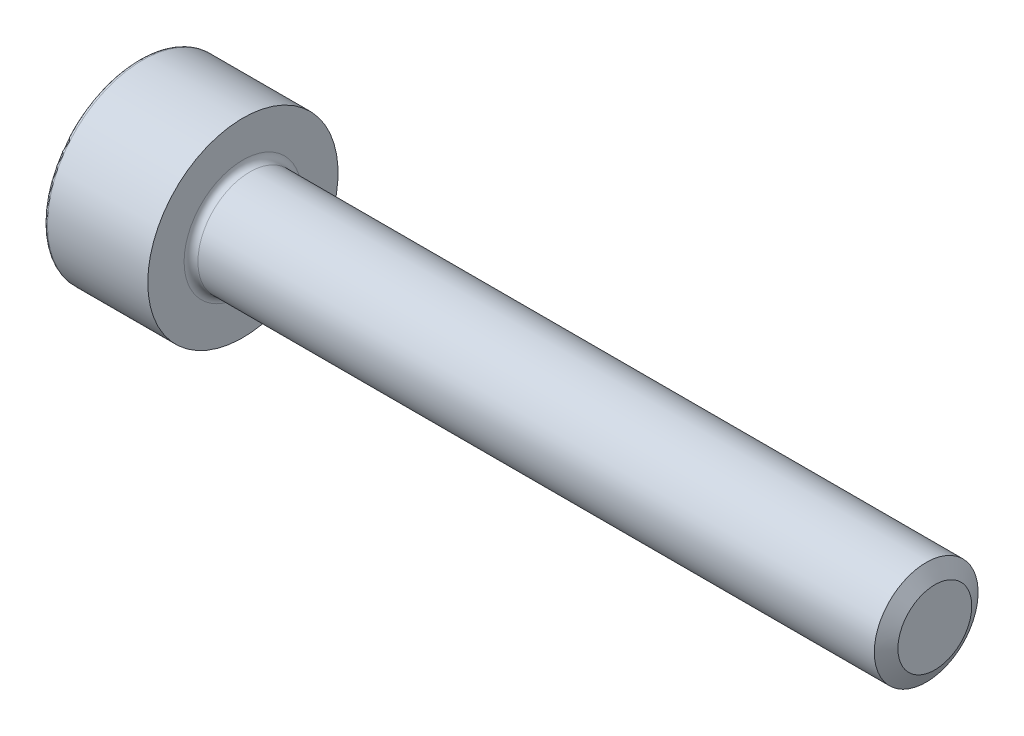
ISO-10303-21;
HEADER;
FILE_DESCRIPTION(('STEP AP214'),'2;1');
FILE_NAME('part.step','',(''),(''),'','','');
FILE_SCHEMA(('AUTOMOTIVE_DESIGN { 1 0 10303 214 1 1 1 1 }'));
ENDSEC;
DATA;
#1=APPLICATION_CONTEXT('core data for automotive mechanical design processes');
#2=APPLICATION_PROTOCOL_DEFINITION('international standard','automotive_design',2000,#1);
#3=PRODUCT_CONTEXT('',#1,'mechanical');
#4=PRODUCT('Part','Part','',(#3));
#5=PRODUCT_RELATED_PRODUCT_CATEGORY('part','',(#4));
#6=PRODUCT_DEFINITION_FORMATION('','',#4);
#7=PRODUCT_DEFINITION_CONTEXT('part definition',#1,'design');
#8=PRODUCT_DEFINITION('design','',#6,#7);
#9=PRODUCT_DEFINITION_SHAPE('','',#8);
#10=(LENGTH_UNIT() NAMED_UNIT(*) SI_UNIT(.MILLI.,.METRE.));
#11=(NAMED_UNIT(*) PLANE_ANGLE_UNIT() SI_UNIT($,.RADIAN.));
#12=(NAMED_UNIT(*) SI_UNIT($,.STERADIAN.) SOLID_ANGLE_UNIT());
#13=UNCERTAINTY_MEASURE_WITH_UNIT(LENGTH_MEASURE(1.E-05),#10,'distance_accuracy_value','');
#14=(GEOMETRIC_REPRESENTATION_CONTEXT(3) GLOBAL_UNCERTAINTY_ASSIGNED_CONTEXT((#13)) GLOBAL_UNIT_ASSIGNED_CONTEXT((#10,
#11,#12)) REPRESENTATION_CONTEXT('',''));
#15=CARTESIAN_POINT('',(0.,0.,0.));
#16=DIRECTION('',(0.,0.,1.));
#17=DIRECTION('',(1.,0.,0.));
#18=AXIS2_PLACEMENT_3D('',#15,#16,#17);
#19=CARTESIAN_POINT('',(0.,0.,0.));
#20=DIRECTION('',(-1.,0.,0.));
#21=DIRECTION('',(0.,0.,1.));
#22=AXIS2_PLACEMENT_3D('',#19,#20,#21);
#23=CYLINDRICAL_SURFACE('',#22,1.5);
#24=CARTESIAN_POINT('',(3.2,0.,0.));
#25=DIRECTION('',(-1.,0.,0.));
#26=DIRECTION('',(0.,0.,1.));
#27=AXIS2_PLACEMENT_3D('',#24,#25,#26);
#28=CIRCLE('',#27,1.5);
#29=CARTESIAN_POINT('',(3.2,0.,1.5));
#30=VERTEX_POINT('',#29);
#31=EDGE_CURVE('E142',#30,#30,#28,.T.);
#32=ORIENTED_EDGE('',*,*,#31,.F.);
#33=EDGE_LOOP('',(#32));
#34=FACE_BOUND('',#33,.T.);
#35=CARTESIAN_POINT('',(22.7500073334409,0.,0.));
#36=DIRECTION('',(-1.,0.,0.));
#37=DIRECTION('',(0.,0.,1.));
#38=AXIS2_PLACEMENT_3D('',#35,#36,#37);
#39=CIRCLE('',#38,1.5);
#40=CARTESIAN_POINT('',(22.7500073334409,0.,1.5));
#41=VERTEX_POINT('',#40);
#42=EDGE_CURVE('E279',#41,#41,#39,.T.);
#43=ORIENTED_EDGE('',*,*,#42,.T.);
#44=EDGE_LOOP('',(#43));
#45=FACE_BOUND('',#44,.T.);
#46=ADVANCED_FACE('F39',(#34,#45),#23,.T.);
#47=CARTESIAN_POINT('',(0.,0.,0.));
#48=DIRECTION('',(1.,0.,0.));
#49=DIRECTION('',(0.,0.,-1.));
#50=AXIS2_PLACEMENT_3D('',#47,#48,#49);
#51=PLANE('',#50);
#52=CARTESIAN_POINT('',(0.,0.,0.));
#53=DIRECTION('',(1.,0.,0.));
#54=DIRECTION('',(0.,0.,-1.));
#55=AXIS2_PLACEMENT_3D('',#52,#53,#54);
#56=CIRCLE('',#55,2.65);
#57=CARTESIAN_POINT('',(0.,0.,-2.65));
#58=VERTEX_POINT('',#57);
#59=EDGE_CURVE('E47',#58,#58,#56,.F.);
#60=ORIENTED_EDGE('',*,*,#59,.T.);
#61=EDGE_LOOP('',(#60));
#62=FACE_BOUND('',#61,.T.);
#63=DIRECTION('',(0.,0.866025403784439,-0.5));
#64=VECTOR('',#63,1.);
#65=CARTESIAN_POINT('',(0.,0.,1.435));
#66=LINE('',#65,#64);
#67=CARTESIAN_POINT('',(0.,0.,1.435));
#68=VERTEX_POINT('',#67);
#69=CARTESIAN_POINT('',(0.,1.24274645443067,0.717499999999999));
#70=VERTEX_POINT('',#69);
#71=EDGE_CURVE('E128',#68,#70,#66,.T.);
#72=ORIENTED_EDGE('',*,*,#71,.F.);
#73=DIRECTION('',(0.,0.866025403784439,0.5));
#74=VECTOR('',#73,1.);
#75=CARTESIAN_POINT('',(0.,-1.24274645443067,0.7175));
#76=LINE('',#75,#74);
#77=CARTESIAN_POINT('',(0.,-1.24274645443067,0.7175));
#78=VERTEX_POINT('',#77);
#79=EDGE_CURVE('E54',#78,#68,#76,.T.);
#80=ORIENTED_EDGE('',*,*,#79,.F.);
#81=DIRECTION('',(0.,0.,1.));
#82=VECTOR('',#81,1.);
#83=CARTESIAN_POINT('',(0.,-1.24274645443067,-0.7175));
#84=LINE('',#83,#82);
#85=CARTESIAN_POINT('',(0.,-1.24274645443067,-0.7175));
#86=VERTEX_POINT('',#85);
#87=EDGE_CURVE('E138',#86,#78,#84,.T.);
#88=ORIENTED_EDGE('',*,*,#87,.F.);
#89=DIRECTION('',(0.,-0.866025403784439,0.5));
#90=VECTOR('',#89,1.);
#91=CARTESIAN_POINT('',(0.,0.,-1.435));
#92=LINE('',#91,#90);
#93=CARTESIAN_POINT('',(0.,0.,-1.435));
#94=VERTEX_POINT('',#93);
#95=EDGE_CURVE('E136',#94,#86,#92,.T.);
#96=ORIENTED_EDGE('',*,*,#95,.F.);
#97=DIRECTION('',(0.,-0.866025403784439,-0.5));
#98=VECTOR('',#97,1.);
#99=CARTESIAN_POINT('',(0.,1.24274645443067,-0.7175));
#100=LINE('',#99,#98);
#101=CARTESIAN_POINT('',(0.,1.24274645443067,-0.7175));
#102=VERTEX_POINT('',#101);
#103=EDGE_CURVE('E102',#102,#94,#100,.T.);
#104=ORIENTED_EDGE('',*,*,#103,.F.);
#105=DIRECTION('',(0.,0.,-1.));
#106=VECTOR('',#105,1.);
#107=CARTESIAN_POINT('',(0.,1.24274645443067,0.717499999999999));
#108=LINE('',#107,#106);
#109=EDGE_CURVE('E132',#70,#102,#108,.T.);
#110=ORIENTED_EDGE('',*,*,#109,.F.);
#111=EDGE_LOOP('',(#72,#80,#88,#96,#104,#110));
#112=FACE_BOUND('',#111,.T.);
#113=ADVANCED_FACE('F159',(#62,#112),#51,.F.);
#114=CARTESIAN_POINT('',(0.,0.,0.));
#115=DIRECTION('',(-1.,0.,0.));
#116=DIRECTION('',(0.,0.,1.));
#117=AXIS2_PLACEMENT_3D('',#114,#115,#116);
#118=CYLINDRICAL_SURFACE('',#117,2.75);
#119=CARTESIAN_POINT('',(0.1,0.,0.));
#120=DIRECTION('',(1.,0.,0.));
#121=DIRECTION('',(0.,0.,-1.));
#122=AXIS2_PLACEMENT_3D('',#119,#120,#121);
#123=CIRCLE('',#122,2.75);
#124=CARTESIAN_POINT('',(0.1,0.,-2.75));
#125=VERTEX_POINT('',#124);
#126=EDGE_CURVE('E11',#125,#125,#123,.T.);
#127=ORIENTED_EDGE('',*,*,#126,.T.);
#128=EDGE_LOOP('',(#127));
#129=FACE_BOUND('',#128,.T.);
#130=CARTESIAN_POINT('',(3.,0.,0.));
#131=DIRECTION('',(-1.,0.,0.));
#132=DIRECTION('',(0.,0.,1.));
#133=AXIS2_PLACEMENT_3D('',#130,#131,#132);
#134=CIRCLE('',#133,2.75);
#135=CARTESIAN_POINT('',(3.,0.,2.75));
#136=VERTEX_POINT('',#135);
#137=EDGE_CURVE('E153',#136,#136,#134,.T.);
#138=ORIENTED_EDGE('',*,*,#137,.T.);
#139=EDGE_LOOP('',(#138));
#140=FACE_BOUND('',#139,.T.);
#141=ADVANCED_FACE('F178',(#129,#140),#118,.T.);
#142=CARTESIAN_POINT('',(3.,2.75,0.));
#143=DIRECTION('',(-1.,0.,0.));
#144=DIRECTION('',(0.,0.,1.));
#145=AXIS2_PLACEMENT_3D('',#142,#143,#144);
#146=PLANE('',#145);
#147=ORIENTED_EDGE('',*,*,#137,.F.);
#148=EDGE_LOOP('',(#147));
#149=FACE_BOUND('',#148,.T.);
#150=CARTESIAN_POINT('',(3.,0.,0.));
#151=DIRECTION('',(-1.,0.,0.));
#152=DIRECTION('',(0.,0.,1.));
#153=AXIS2_PLACEMENT_3D('',#150,#151,#152);
#154=CIRCLE('',#153,1.7);
#155=CARTESIAN_POINT('',(3.,0.,1.7));
#156=VERTEX_POINT('',#155);
#157=EDGE_CURVE('E150',#156,#156,#154,.T.);
#158=ORIENTED_EDGE('',*,*,#157,.T.);
#159=EDGE_LOOP('',(#158));
#160=FACE_BOUND('',#159,.T.);
#161=ADVANCED_FACE('F187',(#149,#160),#146,.F.);
#162=CARTESIAN_POINT('',(3.2,0.,0.));
#163=DIRECTION('',(-1.,0.,0.));
#164=DIRECTION('',(0.,0.,1.));
#165=AXIS2_PLACEMENT_3D('',#162,#163,#164);
#166=TOROIDAL_SURFACE('',#165,1.7,0.2);
#167=ORIENTED_EDGE('',*,*,#157,.F.);
#168=EDGE_LOOP('',(#167));
#169=FACE_BOUND('',#168,.T.);
#170=ORIENTED_EDGE('',*,*,#31,.T.);
#171=EDGE_LOOP('',(#170));
#172=FACE_BOUND('',#171,.T.);
#173=ADVANCED_FACE('F183',(#169,#172),#166,.F.);
#174=CARTESIAN_POINT('',(1.3,-1.24274645443067,0.7175));
#175=DIRECTION('',(0.,-0.5,0.866025403784439));
#176=DIRECTION('',(0.,-0.866025403784439,-0.5));
#177=AXIS2_PLACEMENT_3D('',#174,#175,#176);
#178=PLANE('',#177);
#179=ORIENTED_EDGE('',*,*,#79,.T.);
#180=DIRECTION('',(-1.,0.,0.));
#181=VECTOR('',#180,1.);
#182=CARTESIAN_POINT('',(1.3,0.,1.435));
#183=LINE('',#182,#181);
#184=CARTESIAN_POINT('',(1.3,0.,1.435));
#185=VERTEX_POINT('',#184);
#186=EDGE_CURVE('E84',#185,#68,#183,.T.);
#187=ORIENTED_EDGE('',*,*,#186,.F.);
#188=DIRECTION('',(0.,0.866025403784439,0.5));
#189=VECTOR('',#188,1.);
#190=CARTESIAN_POINT('',(1.3,-1.24274645443067,0.7175));
#191=LINE('',#190,#189);
#192=CARTESIAN_POINT('',(1.3,-1.24274645443067,0.7175));
#193=VERTEX_POINT('',#192);
#194=EDGE_CURVE('E140',#193,#185,#191,.T.);
#195=ORIENTED_EDGE('',*,*,#194,.F.);
#196=DIRECTION('',(-1.,0.,0.));
#197=VECTOR('',#196,1.);
#198=CARTESIAN_POINT('',(1.3,-1.24274645443067,0.7175));
#199=LINE('',#198,#197);
#200=EDGE_CURVE('E62',#193,#78,#199,.T.);
#201=ORIENTED_EDGE('',*,*,#200,.T.);
#202=EDGE_LOOP('',(#179,#187,#195,#201));
#203=FACE_BOUND('',#202,.T.);
#204=ADVANCED_FACE('F186',(#203),#178,.F.);
#205=CARTESIAN_POINT('',(1.3,-1.24274645443067,-0.7175));
#206=DIRECTION('',(0.,-1.,0.));
#207=DIRECTION('',(0.,0.,-1.));
#208=AXIS2_PLACEMENT_3D('',#205,#206,#207);
#209=PLANE('',#208);
#210=ORIENTED_EDGE('',*,*,#87,.T.);
#211=ORIENTED_EDGE('',*,*,#200,.F.);
#212=DIRECTION('',(0.,0.,1.));
#213=VECTOR('',#212,1.);
#214=CARTESIAN_POINT('',(1.3,-1.24274645443067,-0.7175));
#215=LINE('',#214,#213);
#216=CARTESIAN_POINT('',(1.3,-1.24274645443067,-0.7175));
#217=VERTEX_POINT('',#216);
#218=EDGE_CURVE('E114',#217,#193,#215,.T.);
#219=ORIENTED_EDGE('',*,*,#218,.F.);
#220=DIRECTION('',(-1.,0.,0.));
#221=VECTOR('',#220,1.);
#222=CARTESIAN_POINT('',(1.3,-1.24274645443067,-0.7175));
#223=LINE('',#222,#221);
#224=EDGE_CURVE('E106',#217,#86,#223,.T.);
#225=ORIENTED_EDGE('',*,*,#224,.T.);
#226=EDGE_LOOP('',(#210,#211,#219,#225));
#227=FACE_BOUND('',#226,.T.);
#228=ADVANCED_FACE('F217',(#227),#209,.F.);
#229=CARTESIAN_POINT('',(1.3,0.,-1.435));
#230=DIRECTION('',(0.,-0.5,-0.866025403784439));
#231=DIRECTION('',(0.,0.866025403784439,-0.5));
#232=AXIS2_PLACEMENT_3D('',#229,#230,#231);
#233=PLANE('',#232);
#234=ORIENTED_EDGE('',*,*,#95,.T.);
#235=ORIENTED_EDGE('',*,*,#224,.F.);
#236=DIRECTION('',(0.,-0.866025403784439,0.5));
#237=VECTOR('',#236,1.);
#238=CARTESIAN_POINT('',(1.3,0.,-1.435));
#239=LINE('',#238,#237);
#240=CARTESIAN_POINT('',(1.3,0.,-1.435));
#241=VERTEX_POINT('',#240);
#242=EDGE_CURVE('E110',#241,#217,#239,.T.);
#243=ORIENTED_EDGE('',*,*,#242,.F.);
#244=DIRECTION('',(-1.,0.,0.));
#245=VECTOR('',#244,1.);
#246=CARTESIAN_POINT('',(1.3,0.,-1.435));
#247=LINE('',#246,#245);
#248=EDGE_CURVE('E95',#241,#94,#247,.T.);
#249=ORIENTED_EDGE('',*,*,#248,.T.);
#250=EDGE_LOOP('',(#234,#235,#243,#249));
#251=FACE_BOUND('',#250,.T.);
#252=ADVANCED_FACE('F111',(#251),#233,.F.);
#253=CARTESIAN_POINT('',(1.3,1.24274645443067,-0.7175));
#254=DIRECTION('',(0.,0.5,-0.866025403784439));
#255=DIRECTION('',(0.,0.866025403784439,0.5));
#256=AXIS2_PLACEMENT_3D('',#253,#254,#255);
#257=PLANE('',#256);
#258=ORIENTED_EDGE('',*,*,#103,.T.);
#259=ORIENTED_EDGE('',*,*,#248,.F.);
#260=DIRECTION('',(0.,-0.866025403784439,-0.5));
#261=VECTOR('',#260,1.);
#262=CARTESIAN_POINT('',(1.3,1.24274645443067,-0.7175));
#263=LINE('',#262,#261);
#264=CARTESIAN_POINT('',(1.3,1.24274645443067,-0.7175));
#265=VERTEX_POINT('',#264);
#266=EDGE_CURVE('E99',#265,#241,#263,.T.);
#267=ORIENTED_EDGE('',*,*,#266,.F.);
#268=DIRECTION('',(-1.,0.,0.));
#269=VECTOR('',#268,1.);
#270=CARTESIAN_POINT('',(1.3,1.24274645443067,-0.7175));
#271=LINE('',#270,#269);
#272=EDGE_CURVE('E107',#265,#102,#271,.T.);
#273=ORIENTED_EDGE('',*,*,#272,.T.);
#274=EDGE_LOOP('',(#258,#259,#267,#273));
#275=FACE_BOUND('',#274,.T.);
#276=ADVANCED_FACE('F97',(#275),#257,.F.);
#277=CARTESIAN_POINT('',(1.3,1.24274645443067,0.717499999999999));
#278=DIRECTION('',(0.,1.,0.));
#279=DIRECTION('',(0.,0.,1.));
#280=AXIS2_PLACEMENT_3D('',#277,#278,#279);
#281=PLANE('',#280);
#282=ORIENTED_EDGE('',*,*,#109,.T.);
#283=ORIENTED_EDGE('',*,*,#272,.F.);
#284=DIRECTION('',(0.,0.,-1.));
#285=VECTOR('',#284,1.);
#286=CARTESIAN_POINT('',(1.3,1.24274645443067,0.717499999999999));
#287=LINE('',#286,#285);
#288=CARTESIAN_POINT('',(1.3,1.24274645443067,0.717499999999999));
#289=VERTEX_POINT('',#288);
#290=EDGE_CURVE('E120',#289,#265,#287,.T.);
#291=ORIENTED_EDGE('',*,*,#290,.F.);
#292=DIRECTION('',(-1.,0.,0.));
#293=VECTOR('',#292,1.);
#294=CARTESIAN_POINT('',(1.3,1.24274645443067,0.717499999999999));
#295=LINE('',#294,#293);
#296=EDGE_CURVE('E145',#289,#70,#295,.T.);
#297=ORIENTED_EDGE('',*,*,#296,.T.);
#298=EDGE_LOOP('',(#282,#283,#291,#297));
#299=FACE_BOUND('',#298,.T.);
#300=ADVANCED_FACE('F235',(#299),#281,.F.);
#301=CARTESIAN_POINT('',(1.3,0.,1.435));
#302=DIRECTION('',(0.,0.5,0.866025403784439));
#303=DIRECTION('',(0.,-0.866025403784439,0.5));
#304=AXIS2_PLACEMENT_3D('',#301,#302,#303);
#305=PLANE('',#304);
#306=ORIENTED_EDGE('',*,*,#71,.T.);
#307=ORIENTED_EDGE('',*,*,#296,.F.);
#308=DIRECTION('',(0.,0.866025403784439,-0.5));
#309=VECTOR('',#308,1.);
#310=CARTESIAN_POINT('',(1.3,0.,1.435));
#311=LINE('',#310,#309);
#312=EDGE_CURVE('E122',#185,#289,#311,.T.);
#313=ORIENTED_EDGE('',*,*,#312,.F.);
#314=ORIENTED_EDGE('',*,*,#186,.T.);
#315=EDGE_LOOP('',(#306,#307,#313,#314));
#316=FACE_BOUND('',#315,.T.);
#317=ADVANCED_FACE('F242',(#316),#305,.F.);
#318=CARTESIAN_POINT('',(1.3,-1.24274645443067,0.7175));
#319=DIRECTION('',(1.,0.,0.));
#320=DIRECTION('',(0.,0.,-1.));
#321=AXIS2_PLACEMENT_3D('',#318,#319,#320);
#322=PLANE('',#321);
#323=ORIENTED_EDGE('',*,*,#194,.T.);
#324=ORIENTED_EDGE('',*,*,#312,.T.);
#325=ORIENTED_EDGE('',*,*,#290,.T.);
#326=ORIENTED_EDGE('',*,*,#266,.T.);
#327=ORIENTED_EDGE('',*,*,#242,.T.);
#328=ORIENTED_EDGE('',*,*,#218,.T.);
#329=EDGE_LOOP('',(#323,#324,#325,#326,#327,#328));
#330=FACE_BOUND('',#329,.T.);
#331=ADVANCED_FACE('F117',(#330),#322,.F.);
#332=CARTESIAN_POINT('',(22.7500073334409,0.,0.));
#333=DIRECTION('',(-1.,0.,0.));
#334=DIRECTION('',(0.,0.,1.));
#335=AXIS2_PLACEMENT_3D('',#332,#333,#334);
#336=CONICAL_SURFACE('',#335,1.5,1.04719755119659);
#337=CARTESIAN_POINT('',(23.,0.,0.));
#338=DIRECTION('',(-1.,0.,0.));
#339=DIRECTION('',(0.,0.,1.));
#340=AXIS2_PLACEMENT_3D('',#337,#338,#339);
#341=CIRCLE('',#340,1.067);
#342=CARTESIAN_POINT('',(23.,0.,1.067));
#343=VERTEX_POINT('',#342);
#344=EDGE_CURVE('E129',#343,#343,#341,.T.);
#345=ORIENTED_EDGE('',*,*,#344,.T.);
#346=EDGE_LOOP('',(#345));
#347=FACE_BOUND('',#346,.T.);
#348=ORIENTED_EDGE('',*,*,#42,.F.);
#349=EDGE_LOOP('',(#348));
#350=FACE_BOUND('',#349,.T.);
#351=ADVANCED_FACE('F168',(#347,#350),#336,.T.);
#352=CARTESIAN_POINT('',(23.,1.5,0.));
#353=DIRECTION('',(-1.,0.,0.));
#354=DIRECTION('',(0.,0.,1.));
#355=AXIS2_PLACEMENT_3D('',#352,#353,#354);
#356=PLANE('',#355);
#357=ORIENTED_EDGE('',*,*,#344,.F.);
#358=EDGE_LOOP('',(#357));
#359=FACE_BOUND('',#358,.T.);
#360=ADVANCED_FACE('F163',(#359),#356,.F.);
#361=CARTESIAN_POINT('',(0.1,0.,0.));
#362=DIRECTION('',(1.,0.,0.));
#363=DIRECTION('',(0.,0.,-1.));
#364=AXIS2_PLACEMENT_3D('',#361,#362,#363);
#365=TOROIDAL_SURFACE('',#364,2.65,0.1);
#366=ORIENTED_EDGE('',*,*,#126,.F.);
#367=EDGE_LOOP('',(#366));
#368=FACE_BOUND('',#367,.T.);
#369=ORIENTED_EDGE('',*,*,#59,.F.);
#370=EDGE_LOOP('',(#369));
#371=FACE_BOUND('',#370,.T.);
#372=ADVANCED_FACE('F41',(#368,#371),#365,.T.);
#373=CLOSED_SHELL('',(#46,#113,#141,#161,#173,#204,#228,#252,#276,#300,#317,#331,#351,#360,#372));
#374=MANIFOLD_SOLID_BREP('B2',#373);
#375=ADVANCED_BREP_SHAPE_REPRESENTATION('',(#18,#374),#14);
#376=SHAPE_DEFINITION_REPRESENTATION(#9,#375);
ENDSEC;
END-ISO-10303-21;
